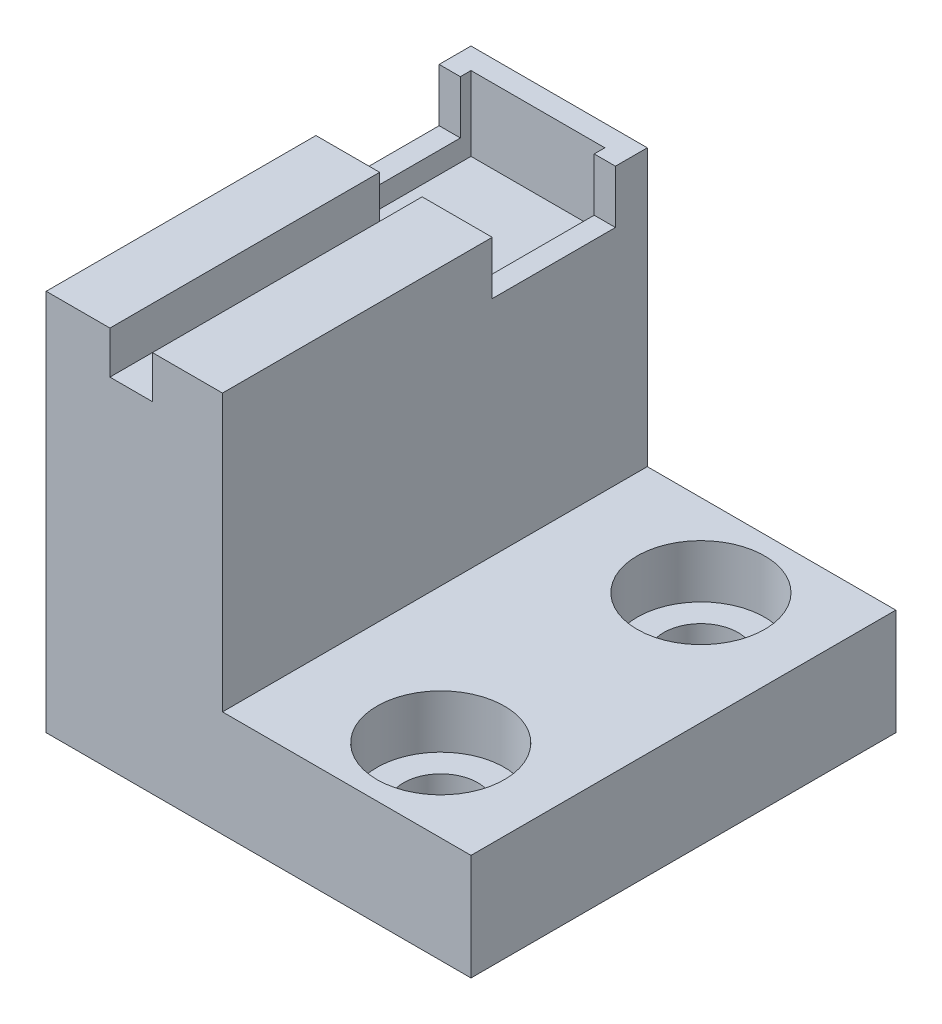
ISO-10303-21;
HEADER;
FILE_DESCRIPTION(('STEP AP214'),'2;1');
FILE_NAME('part.step','',(''),(''),'','','');
FILE_SCHEMA(('AUTOMOTIVE_DESIGN { 1 0 10303 214 1 1 1 1 }'));
ENDSEC;
DATA;
#1=APPLICATION_CONTEXT('core data for automotive mechanical design processes');
#2=APPLICATION_PROTOCOL_DEFINITION('international standard','automotive_design',2000,#1);
#3=PRODUCT_CONTEXT('',#1,'mechanical');
#4=PRODUCT('Part','Part','',(#3));
#5=PRODUCT_RELATED_PRODUCT_CATEGORY('part','',(#4));
#6=PRODUCT_DEFINITION_FORMATION('','',#4);
#7=PRODUCT_DEFINITION_CONTEXT('part definition',#1,'design');
#8=PRODUCT_DEFINITION('design','',#6,#7);
#9=PRODUCT_DEFINITION_SHAPE('','',#8);
#10=(LENGTH_UNIT() NAMED_UNIT(*) SI_UNIT(.MILLI.,.METRE.));
#11=(NAMED_UNIT(*) PLANE_ANGLE_UNIT() SI_UNIT($,.RADIAN.));
#12=(NAMED_UNIT(*) SI_UNIT($,.STERADIAN.) SOLID_ANGLE_UNIT());
#13=UNCERTAINTY_MEASURE_WITH_UNIT(LENGTH_MEASURE(1.E-05),#10,'distance_accuracy_value','');
#14=(GEOMETRIC_REPRESENTATION_CONTEXT(3) GLOBAL_UNCERTAINTY_ASSIGNED_CONTEXT((#13)) GLOBAL_UNIT_ASSIGNED_CONTEXT((#10,
#11,#12)) REPRESENTATION_CONTEXT('',''));
#15=CARTESIAN_POINT('',(0.,0.,0.));
#16=DIRECTION('',(0.,0.,1.));
#17=DIRECTION('',(1.,0.,0.));
#18=AXIS2_PLACEMENT_3D('',#15,#16,#17);
#19=CARTESIAN_POINT('',(20.,36.,-20.));
#20=DIRECTION('',(-1.,0.,0.));
#21=DIRECTION('',(0.,0.,1.));
#22=AXIS2_PLACEMENT_3D('',#19,#20,#21);
#23=PLANE('',#22);
#24=DIRECTION('',(0.,0.,-1.));
#25=VECTOR('',#24,1.);
#26=CARTESIAN_POINT('',(20.,10.,-20.));
#27=LINE('',#26,#25);
#28=CARTESIAN_POINT('',(20.,10.,20.));
#29=VERTEX_POINT('',#28);
#30=CARTESIAN_POINT('',(20.,10.,-20.));
#31=VERTEX_POINT('',#30);
#32=EDGE_CURVE('E200',#29,#31,#27,.T.);
#33=ORIENTED_EDGE('',*,*,#32,.F.);
#34=DIRECTION('',(0.,-1.,0.));
#35=VECTOR('',#34,1.);
#36=CARTESIAN_POINT('',(20.,36.,20.));
#37=LINE('',#36,#35);
#38=CARTESIAN_POINT('',(20.,0.,20.));
#39=VERTEX_POINT('',#38);
#40=EDGE_CURVE('E199',#29,#39,#37,.T.);
#41=ORIENTED_EDGE('',*,*,#40,.T.);
#42=DIRECTION('',(0.,0.,-1.));
#43=VECTOR('',#42,1.);
#44=CARTESIAN_POINT('',(20.,0.,-20.));
#45=LINE('',#44,#43);
#46=CARTESIAN_POINT('',(20.,0.,-20.));
#47=VERTEX_POINT('',#46);
#48=EDGE_CURVE('E296',#39,#47,#45,.T.);
#49=ORIENTED_EDGE('',*,*,#48,.T.);
#50=DIRECTION('',(0.,-1.,0.));
#51=VECTOR('',#50,1.);
#52=CARTESIAN_POINT('',(20.,36.,-20.));
#53=LINE('',#52,#51);
#54=EDGE_CURVE('E11',#31,#47,#53,.T.);
#55=ORIENTED_EDGE('',*,*,#54,.F.);
#56=EDGE_LOOP('',(#33,#41,#49,#55));
#57=FACE_BOUND('',#56,.T.);
#58=ADVANCED_FACE('F35',(#57),#23,.F.);
#59=CARTESIAN_POINT('',(0.,36.,0.));
#60=DIRECTION('',(0.,1.,0.));
#61=DIRECTION('',(0.,0.,1.));
#62=AXIS2_PLACEMENT_3D('',#59,#60,#61);
#63=PLANE('',#62);
#64=DIRECTION('',(0.,0.,1.));
#65=VECTOR('',#64,1.);
#66=CARTESIAN_POINT('',(-3.4,36.,-20.));
#67=LINE('',#66,#65);
#68=CARTESIAN_POINT('',(-3.4,36.,-20.));
#69=VERTEX_POINT('',#68);
#70=CARTESIAN_POINT('',(-3.4,36.,-17.));
#71=VERTEX_POINT('',#70);
#72=EDGE_CURVE('E194',#69,#71,#67,.T.);
#73=ORIENTED_EDGE('',*,*,#72,.F.);
#74=DIRECTION('',(-1.,0.,0.));
#75=VECTOR('',#74,1.);
#76=CARTESIAN_POINT('',(-20.,36.,-20.));
#77=LINE('',#76,#75);
#78=CARTESIAN_POINT('',(-20.,36.,-20.));
#79=VERTEX_POINT('',#78);
#80=EDGE_CURVE('E304',#69,#79,#77,.T.);
#81=ORIENTED_EDGE('',*,*,#80,.T.);
#82=DIRECTION('',(0.,0.,1.));
#83=VECTOR('',#82,1.);
#84=CARTESIAN_POINT('',(-20.,36.,-20.));
#85=LINE('',#84,#83);
#86=CARTESIAN_POINT('',(-20.,36.,-17.));
#87=VERTEX_POINT('',#86);
#88=EDGE_CURVE('E308',#79,#87,#85,.T.);
#89=ORIENTED_EDGE('',*,*,#88,.T.);
#90=DIRECTION('',(-1.,0.,0.));
#91=VECTOR('',#90,1.);
#92=CARTESIAN_POINT('',(-20.,36.,-17.));
#93=LINE('',#92,#91);
#94=CARTESIAN_POINT('',(-18.,36.,-17.));
#95=VERTEX_POINT('',#94);
#96=EDGE_CURVE('E235',#95,#87,#93,.T.);
#97=ORIENTED_EDGE('',*,*,#96,.F.);
#98=DIRECTION('',(0.,0.,1.));
#99=VECTOR('',#98,1.);
#100=CARTESIAN_POINT('',(-18.,36.,-18.));
#101=LINE('',#100,#99);
#102=CARTESIAN_POINT('',(-18.,36.,-18.));
#103=VERTEX_POINT('',#102);
#104=EDGE_CURVE('E287',#103,#95,#101,.T.);
#105=ORIENTED_EDGE('',*,*,#104,.F.);
#106=DIRECTION('',(-1.,0.,0.));
#107=VECTOR('',#106,1.);
#108=CARTESIAN_POINT('',(-18.,36.,-18.));
#109=LINE('',#108,#107);
#110=CARTESIAN_POINT('',(-5.4,36.,-18.));
#111=VERTEX_POINT('',#110);
#112=EDGE_CURVE('E284',#111,#103,#109,.T.);
#113=ORIENTED_EDGE('',*,*,#112,.F.);
#114=DIRECTION('',(0.,0.,-1.));
#115=VECTOR('',#114,1.);
#116=CARTESIAN_POINT('',(-5.4,36.,-18.));
#117=LINE('',#116,#115);
#118=CARTESIAN_POINT('',(-5.4,36.,-17.));
#119=VERTEX_POINT('',#118);
#120=EDGE_CURVE('E248',#119,#111,#117,.T.);
#121=ORIENTED_EDGE('',*,*,#120,.F.);
#122=DIRECTION('',(-1.,0.,0.));
#123=VECTOR('',#122,1.);
#124=CARTESIAN_POINT('',(-5.4,36.,-17.));
#125=LINE('',#124,#123);
#126=EDGE_CURVE('E223',#71,#119,#125,.T.);
#127=ORIENTED_EDGE('',*,*,#126,.F.);
#128=EDGE_LOOP('',(#73,#81,#89,#97,#105,#113,#121,#127));
#129=FACE_BOUND('',#128,.T.);
#130=ADVANCED_FACE('F369',(#129),#63,.T.);
#131=DIRECTION('',(0.,0.,1.));
#132=VECTOR('',#131,1.);
#133=CARTESIAN_POINT('',(-14.,36.,-5.4));
#134=LINE('',#133,#132);
#135=CARTESIAN_POINT('',(-14.,36.,-5.4));
#136=VERTEX_POINT('',#135);
#137=CARTESIAN_POINT('',(-14.,36.,20.));
#138=VERTEX_POINT('',#137);
#139=EDGE_CURVE('E207',#136,#138,#134,.T.);
#140=ORIENTED_EDGE('',*,*,#139,.F.);
#141=DIRECTION('',(1.,0.,0.));
#142=VECTOR('',#141,1.);
#143=CARTESIAN_POINT('',(-18.,36.,-5.4));
#144=LINE('',#143,#142);
#145=CARTESIAN_POINT('',(-20.,36.,-5.4));
#146=VERTEX_POINT('',#145);
#147=EDGE_CURVE('E273',#146,#136,#144,.T.);
#148=ORIENTED_EDGE('',*,*,#147,.F.);
#149=CARTESIAN_POINT('',(-20.,36.,20.));
#150=VERTEX_POINT('',#149);
#151=EDGE_CURVE('E306',#146,#150,#85,.T.);
#152=ORIENTED_EDGE('',*,*,#151,.T.);
#153=DIRECTION('',(1.,0.,0.));
#154=VECTOR('',#153,1.);
#155=CARTESIAN_POINT('',(-20.,36.,20.));
#156=LINE('',#155,#154);
#157=EDGE_CURVE('E312',#150,#138,#156,.T.);
#158=ORIENTED_EDGE('',*,*,#157,.T.);
#159=EDGE_LOOP('',(#140,#148,#152,#158));
#160=FACE_BOUND('',#159,.T.);
#161=ADVANCED_FACE('F374',(#160),#63,.T.);
#162=CARTESIAN_POINT('',(-20.,36.,-20.));
#163=DIRECTION('',(0.,0.,1.));
#164=DIRECTION('',(1.,0.,0.));
#165=AXIS2_PLACEMENT_3D('',#162,#163,#164);
#166=PLANE('',#165);
#167=ORIENTED_EDGE('',*,*,#80,.F.);
#168=DIRECTION('',(0.,1.,0.));
#169=VECTOR('',#168,1.);
#170=CARTESIAN_POINT('',(-3.4,10.,-20.));
#171=LINE('',#170,#169);
#172=CARTESIAN_POINT('',(-3.4,10.,-20.));
#173=VERTEX_POINT('',#172);
#174=EDGE_CURVE('E185',#173,#69,#171,.T.);
#175=ORIENTED_EDGE('',*,*,#174,.F.);
#176=DIRECTION('',(-1.,0.,0.));
#177=VECTOR('',#176,1.);
#178=CARTESIAN_POINT('',(-3.4,10.,-20.));
#179=LINE('',#178,#177);
#180=EDGE_CURVE('E186',#31,#173,#179,.T.);
#181=ORIENTED_EDGE('',*,*,#180,.F.);
#182=ORIENTED_EDGE('',*,*,#54,.T.);
#183=DIRECTION('',(-1.,0.,0.));
#184=VECTOR('',#183,1.);
#185=CARTESIAN_POINT('',(-20.,0.,-20.));
#186=LINE('',#185,#184);
#187=CARTESIAN_POINT('',(-20.,0.,-20.));
#188=VERTEX_POINT('',#187);
#189=EDGE_CURVE('E317',#47,#188,#186,.T.);
#190=ORIENTED_EDGE('',*,*,#189,.T.);
#191=DIRECTION('',(0.,-1.,0.));
#192=VECTOR('',#191,1.);
#193=CARTESIAN_POINT('',(-20.,36.,-20.));
#194=LINE('',#193,#192);
#195=EDGE_CURVE('E43',#79,#188,#194,.T.);
#196=ORIENTED_EDGE('',*,*,#195,.F.);
#197=EDGE_LOOP('',(#167,#175,#181,#182,#190,#196));
#198=FACE_BOUND('',#197,.T.);
#199=ADVANCED_FACE('F381',(#198),#166,.F.);
#200=CARTESIAN_POINT('',(-20.,36.,-20.));
#201=DIRECTION('',(1.,0.,0.));
#202=DIRECTION('',(0.,0.,-1.));
#203=AXIS2_PLACEMENT_3D('',#200,#201,#202);
#204=PLANE('',#203);
#205=DIRECTION('',(0.,0.,1.));
#206=VECTOR('',#205,1.);
#207=CARTESIAN_POINT('',(-20.,31.,-17.));
#208=LINE('',#207,#206);
#209=CARTESIAN_POINT('',(-20.,31.,-17.));
#210=VERTEX_POINT('',#209);
#211=CARTESIAN_POINT('',(-20.,31.,-5.4));
#212=VERTEX_POINT('',#211);
#213=EDGE_CURVE('E231',#210,#212,#208,.T.);
#214=ORIENTED_EDGE('',*,*,#213,.F.);
#215=DIRECTION('',(0.,1.,0.));
#216=VECTOR('',#215,1.);
#217=CARTESIAN_POINT('',(-20.,31.,-17.));
#218=LINE('',#217,#216);
#219=EDGE_CURVE('E245',#210,#87,#218,.T.);
#220=ORIENTED_EDGE('',*,*,#219,.T.);
#221=ORIENTED_EDGE('',*,*,#88,.F.);
#222=ORIENTED_EDGE('',*,*,#195,.T.);
#223=DIRECTION('',(0.,0.,1.));
#224=VECTOR('',#223,1.);
#225=CARTESIAN_POINT('',(-20.,0.,-20.));
#226=LINE('',#225,#224);
#227=CARTESIAN_POINT('',(-20.,0.,20.));
#228=VERTEX_POINT('',#227);
#229=EDGE_CURVE('E319',#188,#228,#226,.T.);
#230=ORIENTED_EDGE('',*,*,#229,.T.);
#231=DIRECTION('',(0.,-1.,0.));
#232=VECTOR('',#231,1.);
#233=CARTESIAN_POINT('',(-20.,36.,20.));
#234=LINE('',#233,#232);
#235=EDGE_CURVE('E323',#150,#228,#234,.T.);
#236=ORIENTED_EDGE('',*,*,#235,.F.);
#237=ORIENTED_EDGE('',*,*,#151,.F.);
#238=DIRECTION('',(0.,1.,0.));
#239=VECTOR('',#238,1.);
#240=CARTESIAN_POINT('',(-20.,31.,-5.4));
#241=LINE('',#240,#239);
#242=EDGE_CURVE('E242',#212,#146,#241,.T.);
#243=ORIENTED_EDGE('',*,*,#242,.F.);
#244=EDGE_LOOP('',(#214,#220,#221,#222,#230,#236,#237,#243));
#245=FACE_BOUND('',#244,.T.);
#246=ADVANCED_FACE('F419',(#245),#204,.F.);
#247=CARTESIAN_POINT('',(-20.,36.,20.));
#248=DIRECTION('',(0.,0.,-1.));
#249=DIRECTION('',(-1.,0.,0.));
#250=AXIS2_PLACEMENT_3D('',#247,#248,#249);
#251=PLANE('',#250);
#252=DIRECTION('',(1.,0.,0.));
#253=VECTOR('',#252,1.);
#254=CARTESIAN_POINT('',(-3.4,10.,20.));
#255=LINE('',#254,#253);
#256=CARTESIAN_POINT('',(-3.4,10.,20.));
#257=VERTEX_POINT('',#256);
#258=EDGE_CURVE('E190',#257,#29,#255,.T.);
#259=ORIENTED_EDGE('',*,*,#258,.F.);
#260=DIRECTION('',(0.,1.,0.));
#261=VECTOR('',#260,1.);
#262=CARTESIAN_POINT('',(-3.4,10.,20.));
#263=LINE('',#262,#261);
#264=CARTESIAN_POINT('',(-3.4,36.,20.));
#265=VERTEX_POINT('',#264);
#266=EDGE_CURVE('E174',#257,#265,#263,.T.);
#267=ORIENTED_EDGE('',*,*,#266,.T.);
#268=CARTESIAN_POINT('',(-10.,36.,20.));
#269=VERTEX_POINT('',#268);
#270=EDGE_CURVE('E311',#269,#265,#156,.T.);
#271=ORIENTED_EDGE('',*,*,#270,.F.);
#272=DIRECTION('',(0.,1.,0.));
#273=VECTOR('',#272,1.);
#274=CARTESIAN_POINT('',(-10.,32.,20.));
#275=LINE('',#274,#273);
#276=CARTESIAN_POINT('',(-10.,32.,20.));
#277=VERTEX_POINT('',#276);
#278=EDGE_CURVE('E227',#277,#269,#275,.T.);
#279=ORIENTED_EDGE('',*,*,#278,.F.);
#280=DIRECTION('',(1.,0.,0.));
#281=VECTOR('',#280,1.);
#282=CARTESIAN_POINT('',(-14.,32.,20.));
#283=LINE('',#282,#281);
#284=CARTESIAN_POINT('',(-14.,32.,20.));
#285=VERTEX_POINT('',#284);
#286=EDGE_CURVE('E212',#285,#277,#283,.T.);
#287=ORIENTED_EDGE('',*,*,#286,.F.);
#288=DIRECTION('',(0.,1.,0.));
#289=VECTOR('',#288,1.);
#290=CARTESIAN_POINT('',(-14.,32.,20.));
#291=LINE('',#290,#289);
#292=EDGE_CURVE('E218',#285,#138,#291,.T.);
#293=ORIENTED_EDGE('',*,*,#292,.T.);
#294=ORIENTED_EDGE('',*,*,#157,.F.);
#295=ORIENTED_EDGE('',*,*,#235,.T.);
#296=DIRECTION('',(1.,0.,0.));
#297=VECTOR('',#296,1.);
#298=CARTESIAN_POINT('',(-20.,0.,20.));
#299=LINE('',#298,#297);
#300=EDGE_CURVE('E307',#228,#39,#299,.T.);
#301=ORIENTED_EDGE('',*,*,#300,.T.);
#302=ORIENTED_EDGE('',*,*,#40,.F.);
#303=EDGE_LOOP('',(#259,#267,#271,#279,#287,#293,#294,#295,#301,#302));
#304=FACE_BOUND('',#303,.T.);
#305=ADVANCED_FACE('F197',(#304),#251,.F.);
#306=CARTESIAN_POINT('',(-3.4,36.,-5.4));
#307=VERTEX_POINT('',#306);
#308=EDGE_CURVE('E180',#307,#265,#67,.T.);
#309=ORIENTED_EDGE('',*,*,#308,.F.);
#310=CARTESIAN_POINT('',(-10.,36.,-5.4));
#311=VERTEX_POINT('',#310);
#312=EDGE_CURVE('E290',#311,#307,#144,.T.);
#313=ORIENTED_EDGE('',*,*,#312,.F.);
#314=DIRECTION('',(0.,0.,-1.));
#315=VECTOR('',#314,1.);
#316=CARTESIAN_POINT('',(-10.,36.,-5.4));
#317=LINE('',#316,#315);
#318=EDGE_CURVE('E213',#269,#311,#317,.T.);
#319=ORIENTED_EDGE('',*,*,#318,.F.);
#320=ORIENTED_EDGE('',*,*,#270,.T.);
#321=EDGE_LOOP('',(#309,#313,#319,#320));
#322=FACE_BOUND('',#321,.T.);
#323=ADVANCED_FACE('F377',(#322),#63,.T.);
#324=CARTESIAN_POINT('',(0.,0.,0.));
#325=DIRECTION('',(0.,1.,0.));
#326=DIRECTION('',(0.,0.,1.));
#327=AXIS2_PLACEMENT_3D('',#324,#325,#326);
#328=PLANE('',#327);
#329=CARTESIAN_POINT('',(9.4,0.,-12.25));
#330=DIRECTION('',(0.,1.,0.));
#331=DIRECTION('',(0.,0.,1.));
#332=AXIS2_PLACEMENT_3D('',#329,#330,#331);
#333=CIRCLE('',#332,3.5);
#334=CARTESIAN_POINT('',(9.4,0.,-8.75));
#335=VERTEX_POINT('',#334);
#336=EDGE_CURVE('E329',#335,#335,#333,.T.);
#337=ORIENTED_EDGE('',*,*,#336,.T.);
#338=EDGE_LOOP('',(#337));
#339=FACE_BOUND('',#338,.T.);
#340=CARTESIAN_POINT('',(9.4,0.,12.25));
#341=DIRECTION('',(0.,1.,0.));
#342=DIRECTION('',(0.,0.,1.));
#343=AXIS2_PLACEMENT_3D('',#340,#341,#342);
#344=CIRCLE('',#343,3.5);
#345=CARTESIAN_POINT('',(9.4,0.,15.75));
#346=VERTEX_POINT('',#345);
#347=EDGE_CURVE('E335',#346,#346,#344,.T.);
#348=ORIENTED_EDGE('',*,*,#347,.T.);
#349=EDGE_LOOP('',(#348));
#350=FACE_BOUND('',#349,.T.);
#351=ORIENTED_EDGE('',*,*,#48,.F.);
#352=ORIENTED_EDGE('',*,*,#300,.F.);
#353=ORIENTED_EDGE('',*,*,#229,.F.);
#354=ORIENTED_EDGE('',*,*,#189,.F.);
#355=EDGE_LOOP('',(#351,#352,#353,#354));
#356=FACE_BOUND('',#355,.T.);
#357=ADVANCED_FACE('F424',(#339,#350,#356),#328,.F.);
#358=CARTESIAN_POINT('',(-5.4,29.,-18.));
#359=DIRECTION('',(1.,0.,0.));
#360=DIRECTION('',(0.,0.,-1.));
#361=AXIS2_PLACEMENT_3D('',#358,#359,#360);
#362=PLANE('',#361);
#363=DIRECTION('',(0.,0.,1.));
#364=VECTOR('',#363,1.);
#365=CARTESIAN_POINT('',(-5.4,31.,-5.4));
#366=LINE('',#365,#364);
#367=CARTESIAN_POINT('',(-5.4,31.,-17.));
#368=VERTEX_POINT('',#367);
#369=CARTESIAN_POINT('',(-5.4,31.,-5.4));
#370=VERTEX_POINT('',#369);
#371=EDGE_CURVE('E59',#368,#370,#366,.T.);
#372=ORIENTED_EDGE('',*,*,#371,.F.);
#373=DIRECTION('',(0.,1.,0.));
#374=VECTOR('',#373,1.);
#375=CARTESIAN_POINT('',(-5.4,31.,-17.));
#376=LINE('',#375,#374);
#377=EDGE_CURVE('E244',#368,#119,#376,.T.);
#378=ORIENTED_EDGE('',*,*,#377,.T.);
#379=ORIENTED_EDGE('',*,*,#120,.T.);
#380=DIRECTION('',(0.,1.,0.));
#381=VECTOR('',#380,1.);
#382=CARTESIAN_POINT('',(-5.4,29.,-18.));
#383=LINE('',#382,#381);
#384=CARTESIAN_POINT('',(-5.4,29.,-18.));
#385=VERTEX_POINT('',#384);
#386=EDGE_CURVE('E282',#385,#111,#383,.T.);
#387=ORIENTED_EDGE('',*,*,#386,.F.);
#388=DIRECTION('',(0.,0.,-1.));
#389=VECTOR('',#388,1.);
#390=CARTESIAN_POINT('',(-5.4,29.,-18.));
#391=LINE('',#390,#389);
#392=CARTESIAN_POINT('',(-5.4,29.,-5.4));
#393=VERTEX_POINT('',#392);
#394=EDGE_CURVE('E269',#393,#385,#391,.T.);
#395=ORIENTED_EDGE('',*,*,#394,.F.);
#396=DIRECTION('',(0.,1.,0.));
#397=VECTOR('',#396,1.);
#398=CARTESIAN_POINT('',(-5.4,29.,-5.4));
#399=LINE('',#398,#397);
#400=EDGE_CURVE('E293',#393,#370,#399,.T.);
#401=ORIENTED_EDGE('',*,*,#400,.T.);
#402=EDGE_LOOP('',(#372,#378,#379,#387,#395,#401));
#403=FACE_BOUND('',#402,.T.);
#404=ADVANCED_FACE('F392',(#403),#362,.F.);
#405=CARTESIAN_POINT('',(-18.,29.,-5.4));
#406=DIRECTION('',(0.,0.,1.));
#407=DIRECTION('',(1.,0.,0.));
#408=AXIS2_PLACEMENT_3D('',#405,#406,#407);
#409=PLANE('',#408);
#410=ORIENTED_EDGE('',*,*,#147,.T.);
#411=DIRECTION('',(0.,1.,0.));
#412=VECTOR('',#411,1.);
#413=CARTESIAN_POINT('',(-14.,32.,-5.4));
#414=LINE('',#413,#412);
#415=CARTESIAN_POINT('',(-14.,32.,-5.4));
#416=VERTEX_POINT('',#415);
#417=EDGE_CURVE('E221',#416,#136,#414,.T.);
#418=ORIENTED_EDGE('',*,*,#417,.F.);
#419=DIRECTION('',(-1.,0.,0.));
#420=VECTOR('',#419,1.);
#421=CARTESIAN_POINT('',(-14.,32.,-5.4));
#422=LINE('',#421,#420);
#423=CARTESIAN_POINT('',(-10.,32.,-5.4));
#424=VERTEX_POINT('',#423);
#425=EDGE_CURVE('E216',#424,#416,#422,.T.);
#426=ORIENTED_EDGE('',*,*,#425,.F.);
#427=DIRECTION('',(0.,1.,0.));
#428=VECTOR('',#427,1.);
#429=CARTESIAN_POINT('',(-10.,32.,-5.4));
#430=LINE('',#429,#428);
#431=EDGE_CURVE('E224',#424,#311,#430,.T.);
#432=ORIENTED_EDGE('',*,*,#431,.T.);
#433=ORIENTED_EDGE('',*,*,#312,.T.);
#434=DIRECTION('',(0.,1.,0.));
#435=VECTOR('',#434,1.);
#436=CARTESIAN_POINT('',(-3.4,31.,-5.4));
#437=LINE('',#436,#435);
#438=CARTESIAN_POINT('',(-3.4,31.,-5.4));
#439=VERTEX_POINT('',#438);
#440=EDGE_CURVE('E261',#439,#307,#437,.T.);
#441=ORIENTED_EDGE('',*,*,#440,.F.);
#442=DIRECTION('',(1.,0.,0.));
#443=VECTOR('',#442,1.);
#444=CARTESIAN_POINT('',(-5.4,31.,-5.4));
#445=LINE('',#444,#443);
#446=EDGE_CURVE('E254',#370,#439,#445,.T.);
#447=ORIENTED_EDGE('',*,*,#446,.F.);
#448=ORIENTED_EDGE('',*,*,#400,.F.);
#449=DIRECTION('',(1.,0.,0.));
#450=VECTOR('',#449,1.);
#451=CARTESIAN_POINT('',(-18.,29.,-5.4));
#452=LINE('',#451,#450);
#453=CARTESIAN_POINT('',(-18.,29.,-5.4));
#454=VERTEX_POINT('',#453);
#455=EDGE_CURVE('E279',#454,#393,#452,.T.);
#456=ORIENTED_EDGE('',*,*,#455,.F.);
#457=DIRECTION('',(0.,1.,0.));
#458=VECTOR('',#457,1.);
#459=CARTESIAN_POINT('',(-18.,29.,-5.4));
#460=LINE('',#459,#458);
#461=CARTESIAN_POINT('',(-18.,31.,-5.4));
#462=VERTEX_POINT('',#461);
#463=EDGE_CURVE('E297',#454,#462,#460,.T.);
#464=ORIENTED_EDGE('',*,*,#463,.T.);
#465=DIRECTION('',(1.,0.,0.));
#466=VECTOR('',#465,1.);
#467=CARTESIAN_POINT('',(-20.,31.,-5.4));
#468=LINE('',#467,#466);
#469=EDGE_CURVE('E234',#212,#462,#468,.T.);
#470=ORIENTED_EDGE('',*,*,#469,.F.);
#471=ORIENTED_EDGE('',*,*,#242,.T.);
#472=EDGE_LOOP('',(#410,#418,#426,#432,#433,#441,#447,#448,#456,#464,#470,#471));
#473=FACE_BOUND('',#472,.T.);
#474=ADVANCED_FACE('F396',(#473),#409,.F.);
#475=CARTESIAN_POINT('',(-18.,29.,-18.));
#476=DIRECTION('',(-1.,0.,0.));
#477=DIRECTION('',(0.,0.,1.));
#478=AXIS2_PLACEMENT_3D('',#475,#476,#477);
#479=PLANE('',#478);
#480=ORIENTED_EDGE('',*,*,#104,.T.);
#481=DIRECTION('',(0.,1.,0.));
#482=VECTOR('',#481,1.);
#483=CARTESIAN_POINT('',(-18.,31.,-17.));
#484=LINE('',#483,#482);
#485=CARTESIAN_POINT('',(-18.,31.,-17.));
#486=VERTEX_POINT('',#485);
#487=EDGE_CURVE('E249',#486,#95,#484,.T.);
#488=ORIENTED_EDGE('',*,*,#487,.F.);
#489=DIRECTION('',(0.,0.,-1.));
#490=VECTOR('',#489,1.);
#491=CARTESIAN_POINT('',(-18.,31.,-17.));
#492=LINE('',#491,#490);
#493=EDGE_CURVE('E237',#462,#486,#492,.T.);
#494=ORIENTED_EDGE('',*,*,#493,.F.);
#495=ORIENTED_EDGE('',*,*,#463,.F.);
#496=DIRECTION('',(0.,0.,1.));
#497=VECTOR('',#496,1.);
#498=CARTESIAN_POINT('',(-18.,29.,-18.));
#499=LINE('',#498,#497);
#500=CARTESIAN_POINT('',(-18.,29.,-18.));
#501=VERTEX_POINT('',#500);
#502=EDGE_CURVE('E276',#501,#454,#499,.T.);
#503=ORIENTED_EDGE('',*,*,#502,.F.);
#504=DIRECTION('',(0.,1.,0.));
#505=VECTOR('',#504,1.);
#506=CARTESIAN_POINT('',(-18.,29.,-18.));
#507=LINE('',#506,#505);
#508=EDGE_CURVE('E300',#501,#103,#507,.T.);
#509=ORIENTED_EDGE('',*,*,#508,.T.);
#510=EDGE_LOOP('',(#480,#488,#494,#495,#503,#509));
#511=FACE_BOUND('',#510,.T.);
#512=ADVANCED_FACE('F431',(#511),#479,.F.);
#513=CARTESIAN_POINT('',(-18.,29.,-18.));
#514=DIRECTION('',(0.,0.,-1.));
#515=DIRECTION('',(-1.,0.,0.));
#516=AXIS2_PLACEMENT_3D('',#513,#514,#515);
#517=PLANE('',#516);
#518=ORIENTED_EDGE('',*,*,#112,.T.);
#519=ORIENTED_EDGE('',*,*,#508,.F.);
#520=DIRECTION('',(-1.,0.,0.));
#521=VECTOR('',#520,1.);
#522=CARTESIAN_POINT('',(-18.,29.,-18.));
#523=LINE('',#522,#521);
#524=EDGE_CURVE('E272',#385,#501,#523,.T.);
#525=ORIENTED_EDGE('',*,*,#524,.F.);
#526=ORIENTED_EDGE('',*,*,#386,.T.);
#527=EDGE_LOOP('',(#518,#519,#525,#526));
#528=FACE_BOUND('',#527,.T.);
#529=ADVANCED_FACE('F436',(#528),#517,.F.);
#530=CARTESIAN_POINT('',(0.,29.,0.));
#531=DIRECTION('',(0.,1.,0.));
#532=DIRECTION('',(0.,0.,1.));
#533=AXIS2_PLACEMENT_3D('',#530,#531,#532);
#534=PLANE('',#533);
#535=ORIENTED_EDGE('',*,*,#394,.T.);
#536=ORIENTED_EDGE('',*,*,#524,.T.);
#537=ORIENTED_EDGE('',*,*,#502,.T.);
#538=ORIENTED_EDGE('',*,*,#455,.T.);
#539=EDGE_LOOP('',(#535,#536,#537,#538));
#540=FACE_BOUND('',#539,.T.);
#541=ADVANCED_FACE('F438',(#540),#534,.T.);
#542=CARTESIAN_POINT('',(-20.,31.,-17.));
#543=DIRECTION('',(0.,0.,-1.));
#544=DIRECTION('',(-1.,0.,0.));
#545=AXIS2_PLACEMENT_3D('',#542,#543,#544);
#546=PLANE('',#545);
#547=ORIENTED_EDGE('',*,*,#96,.T.);
#548=ORIENTED_EDGE('',*,*,#219,.F.);
#549=DIRECTION('',(-1.,0.,0.));
#550=VECTOR('',#549,1.);
#551=CARTESIAN_POINT('',(-20.,31.,-17.));
#552=LINE('',#551,#550);
#553=EDGE_CURVE('E239',#486,#210,#552,.T.);
#554=ORIENTED_EDGE('',*,*,#553,.F.);
#555=ORIENTED_EDGE('',*,*,#487,.T.);
#556=EDGE_LOOP('',(#547,#548,#554,#555));
#557=FACE_BOUND('',#556,.T.);
#558=ADVANCED_FACE('F440',(#557),#546,.F.);
#559=CARTESIAN_POINT('',(0.,31.,0.));
#560=DIRECTION('',(0.,1.,0.));
#561=DIRECTION('',(0.,0.,1.));
#562=AXIS2_PLACEMENT_3D('',#559,#560,#561);
#563=PLANE('',#562);
#564=ORIENTED_EDGE('',*,*,#213,.T.);
#565=ORIENTED_EDGE('',*,*,#469,.T.);
#566=ORIENTED_EDGE('',*,*,#493,.T.);
#567=ORIENTED_EDGE('',*,*,#553,.T.);
#568=EDGE_LOOP('',(#564,#565,#566,#567));
#569=FACE_BOUND('',#568,.T.);
#570=ADVANCED_FACE('F446',(#569),#563,.T.);
#571=CARTESIAN_POINT('',(-5.4,31.,-17.));
#572=DIRECTION('',(0.,0.,-1.));
#573=DIRECTION('',(-1.,0.,0.));
#574=AXIS2_PLACEMENT_3D('',#571,#572,#573);
#575=PLANE('',#574);
#576=ORIENTED_EDGE('',*,*,#126,.T.);
#577=ORIENTED_EDGE('',*,*,#377,.F.);
#578=DIRECTION('',(-1.,0.,0.));
#579=VECTOR('',#578,1.);
#580=CARTESIAN_POINT('',(-5.4,31.,-17.));
#581=LINE('',#580,#579);
#582=CARTESIAN_POINT('',(-3.4,31.,-17.));
#583=VERTEX_POINT('',#582);
#584=EDGE_CURVE('E259',#583,#368,#581,.T.);
#585=ORIENTED_EDGE('',*,*,#584,.F.);
#586=DIRECTION('',(0.,1.,0.));
#587=VECTOR('',#586,1.);
#588=CARTESIAN_POINT('',(-3.4,31.,-17.));
#589=LINE('',#588,#587);
#590=EDGE_CURVE('E265',#583,#71,#589,.T.);
#591=ORIENTED_EDGE('',*,*,#590,.T.);
#592=EDGE_LOOP('',(#576,#577,#585,#591));
#593=FACE_BOUND('',#592,.T.);
#594=ADVANCED_FACE('F389',(#593),#575,.F.);
#595=CARTESIAN_POINT('',(0.,31.,0.));
#596=DIRECTION('',(0.,-1.,0.));
#597=DIRECTION('',(0.,0.,-1.));
#598=AXIS2_PLACEMENT_3D('',#595,#596,#597);
#599=PLANE('',#598);
#600=ORIENTED_EDGE('',*,*,#371,.T.);
#601=ORIENTED_EDGE('',*,*,#446,.T.);
#602=DIRECTION('',(0.,0.,-1.));
#603=VECTOR('',#602,1.);
#604=CARTESIAN_POINT('',(-3.4,31.,-5.4));
#605=LINE('',#604,#603);
#606=EDGE_CURVE('E256',#439,#583,#605,.T.);
#607=ORIENTED_EDGE('',*,*,#606,.T.);
#608=ORIENTED_EDGE('',*,*,#584,.T.);
#609=EDGE_LOOP('',(#600,#601,#607,#608));
#610=FACE_BOUND('',#609,.T.);
#611=ADVANCED_FACE('F399',(#610),#599,.F.);
#612=CARTESIAN_POINT('',(-14.,32.,-5.4));
#613=DIRECTION('',(-1.,0.,0.));
#614=DIRECTION('',(0.,0.,1.));
#615=AXIS2_PLACEMENT_3D('',#612,#613,#614);
#616=PLANE('',#615);
#617=ORIENTED_EDGE('',*,*,#139,.T.);
#618=ORIENTED_EDGE('',*,*,#292,.F.);
#619=DIRECTION('',(0.,0.,1.));
#620=VECTOR('',#619,1.);
#621=CARTESIAN_POINT('',(-14.,32.,-5.4));
#622=LINE('',#621,#620);
#623=EDGE_CURVE('E209',#416,#285,#622,.T.);
#624=ORIENTED_EDGE('',*,*,#623,.F.);
#625=ORIENTED_EDGE('',*,*,#417,.T.);
#626=EDGE_LOOP('',(#617,#618,#624,#625));
#627=FACE_BOUND('',#626,.T.);
#628=ADVANCED_FACE('F411',(#627),#616,.F.);
#629=CARTESIAN_POINT('',(-10.,32.,-5.4));
#630=DIRECTION('',(1.,0.,0.));
#631=DIRECTION('',(0.,0.,-1.));
#632=AXIS2_PLACEMENT_3D('',#629,#630,#631);
#633=PLANE('',#632);
#634=ORIENTED_EDGE('',*,*,#318,.T.);
#635=ORIENTED_EDGE('',*,*,#431,.F.);
#636=DIRECTION('',(0.,0.,-1.));
#637=VECTOR('',#636,1.);
#638=CARTESIAN_POINT('',(-10.,32.,-5.4));
#639=LINE('',#638,#637);
#640=EDGE_CURVE('E51',#277,#424,#639,.T.);
#641=ORIENTED_EDGE('',*,*,#640,.F.);
#642=ORIENTED_EDGE('',*,*,#278,.T.);
#643=EDGE_LOOP('',(#634,#635,#641,#642));
#644=FACE_BOUND('',#643,.T.);
#645=ADVANCED_FACE('F406',(#644),#633,.F.);
#646=CARTESIAN_POINT('',(0.,32.,0.));
#647=DIRECTION('',(0.,1.,0.));
#648=DIRECTION('',(0.,0.,1.));
#649=AXIS2_PLACEMENT_3D('',#646,#647,#648);
#650=PLANE('',#649);
#651=ORIENTED_EDGE('',*,*,#623,.T.);
#652=ORIENTED_EDGE('',*,*,#286,.T.);
#653=ORIENTED_EDGE('',*,*,#640,.T.);
#654=ORIENTED_EDGE('',*,*,#425,.T.);
#655=EDGE_LOOP('',(#651,#652,#653,#654));
#656=FACE_BOUND('',#655,.T.);
#657=ADVANCED_FACE('F365',(#656),#650,.T.);
#658=CARTESIAN_POINT('',(-3.4,10.,-20.));
#659=DIRECTION('',(-1.,0.,0.));
#660=DIRECTION('',(0.,0.,1.));
#661=AXIS2_PLACEMENT_3D('',#658,#659,#660);
#662=PLANE('',#661);
#663=ORIENTED_EDGE('',*,*,#308,.T.);
#664=ORIENTED_EDGE('',*,*,#266,.F.);
#665=DIRECTION('',(0.,0.,1.));
#666=VECTOR('',#665,1.);
#667=CARTESIAN_POINT('',(-3.4,10.,-20.));
#668=LINE('',#667,#666);
#669=EDGE_CURVE('E177',#173,#257,#668,.T.);
#670=ORIENTED_EDGE('',*,*,#669,.F.);
#671=ORIENTED_EDGE('',*,*,#174,.T.);
#672=ORIENTED_EDGE('',*,*,#72,.T.);
#673=ORIENTED_EDGE('',*,*,#590,.F.);
#674=ORIENTED_EDGE('',*,*,#606,.F.);
#675=ORIENTED_EDGE('',*,*,#440,.T.);
#676=EDGE_LOOP('',(#663,#664,#670,#671,#672,#673,#674,#675));
#677=FACE_BOUND('',#676,.T.);
#678=ADVANCED_FACE('F176',(#677),#662,.F.);
#679=CARTESIAN_POINT('',(0.,10.,0.));
#680=DIRECTION('',(0.,1.,0.));
#681=DIRECTION('',(0.,0.,1.));
#682=AXIS2_PLACEMENT_3D('',#679,#680,#681);
#683=PLANE('',#682);
#684=CARTESIAN_POINT('',(9.4,10.,-12.25));
#685=DIRECTION('',(0.,1.,0.));
#686=DIRECTION('',(0.,0.,1.));
#687=AXIS2_PLACEMENT_3D('',#684,#685,#686);
#688=CIRCLE('',#687,6.);
#689=CARTESIAN_POINT('',(9.4,10.,-6.25));
#690=VERTEX_POINT('',#689);
#691=EDGE_CURVE('E345',#690,#690,#688,.T.);
#692=ORIENTED_EDGE('',*,*,#691,.F.);
#693=EDGE_LOOP('',(#692));
#694=FACE_BOUND('',#693,.T.);
#695=CARTESIAN_POINT('',(9.4,10.,12.25));
#696=DIRECTION('',(0.,1.,0.));
#697=DIRECTION('',(0.,0.,1.));
#698=AXIS2_PLACEMENT_3D('',#695,#696,#697);
#699=CIRCLE('',#698,6.);
#700=CARTESIAN_POINT('',(9.4,10.,18.25));
#701=VERTEX_POINT('',#700);
#702=EDGE_CURVE('E333',#701,#701,#699,.T.);
#703=ORIENTED_EDGE('',*,*,#702,.F.);
#704=EDGE_LOOP('',(#703));
#705=FACE_BOUND('',#704,.T.);
#706=ORIENTED_EDGE('',*,*,#669,.T.);
#707=ORIENTED_EDGE('',*,*,#258,.T.);
#708=ORIENTED_EDGE('',*,*,#32,.T.);
#709=ORIENTED_EDGE('',*,*,#180,.T.);
#710=EDGE_LOOP('',(#706,#707,#708,#709));
#711=FACE_BOUND('',#710,.T.);
#712=ADVANCED_FACE('F189',(#694,#705,#711),#683,.T.);
#713=CARTESIAN_POINT('',(9.4,5.,12.25));
#714=DIRECTION('',(0.,1.,0.));
#715=DIRECTION('',(0.,0.,1.));
#716=AXIS2_PLACEMENT_3D('',#713,#714,#715);
#717=CYLINDRICAL_SURFACE('',#716,6.);
#718=CARTESIAN_POINT('',(9.4,5.,12.25));
#719=DIRECTION('',(0.,1.,0.));
#720=DIRECTION('',(0.,0.,1.));
#721=AXIS2_PLACEMENT_3D('',#718,#719,#720);
#722=CIRCLE('',#721,6.);
#723=CARTESIAN_POINT('',(9.4,5.,18.25));
#724=VERTEX_POINT('',#723);
#725=EDGE_CURVE('E348',#724,#724,#722,.T.);
#726=ORIENTED_EDGE('',*,*,#725,.F.);
#727=EDGE_LOOP('',(#726));
#728=FACE_BOUND('',#727,.T.);
#729=ORIENTED_EDGE('',*,*,#702,.T.);
#730=EDGE_LOOP('',(#729));
#731=FACE_BOUND('',#730,.T.);
#732=ADVANCED_FACE('F353',(#728,#731),#717,.F.);
#733=CARTESIAN_POINT('',(9.4,5.,12.25));
#734=DIRECTION('',(0.,1.,0.));
#735=DIRECTION('',(0.,0.,1.));
#736=AXIS2_PLACEMENT_3D('',#733,#734,#735);
#737=PLANE('',#736);
#738=CARTESIAN_POINT('',(9.4,5.,12.25));
#739=DIRECTION('',(0.,1.,0.));
#740=DIRECTION('',(0.,0.,1.));
#741=AXIS2_PLACEMENT_3D('',#738,#739,#740);
#742=CIRCLE('',#741,3.5);
#743=CARTESIAN_POINT('',(9.4,5.,15.75));
#744=VERTEX_POINT('',#743);
#745=EDGE_CURVE('E38',#744,#744,#742,.T.);
#746=ORIENTED_EDGE('',*,*,#745,.F.);
#747=EDGE_LOOP('',(#746));
#748=FACE_BOUND('',#747,.T.);
#749=ORIENTED_EDGE('',*,*,#725,.T.);
#750=EDGE_LOOP('',(#749));
#751=FACE_BOUND('',#750,.T.);
#752=ADVANCED_FACE('F362',(#748,#751),#737,.T.);
#753=CARTESIAN_POINT('',(9.4,5.,-12.25));
#754=DIRECTION('',(0.,1.,0.));
#755=DIRECTION('',(0.,0.,1.));
#756=AXIS2_PLACEMENT_3D('',#753,#754,#755);
#757=CYLINDRICAL_SURFACE('',#756,6.);
#758=CARTESIAN_POINT('',(9.4,5.,-12.25));
#759=DIRECTION('',(0.,1.,0.));
#760=DIRECTION('',(0.,0.,1.));
#761=AXIS2_PLACEMENT_3D('',#758,#759,#760);
#762=CIRCLE('',#761,6.);
#763=CARTESIAN_POINT('',(9.4,5.,-6.25));
#764=VERTEX_POINT('',#763);
#765=EDGE_CURVE('E342',#764,#764,#762,.T.);
#766=ORIENTED_EDGE('',*,*,#765,.F.);
#767=EDGE_LOOP('',(#766));
#768=FACE_BOUND('',#767,.T.);
#769=ORIENTED_EDGE('',*,*,#691,.T.);
#770=EDGE_LOOP('',(#769));
#771=FACE_BOUND('',#770,.T.);
#772=ADVANCED_FACE('F547',(#768,#771),#757,.F.);
#773=CARTESIAN_POINT('',(9.4,5.,-12.25));
#774=DIRECTION('',(0.,1.,0.));
#775=DIRECTION('',(0.,0.,1.));
#776=AXIS2_PLACEMENT_3D('',#773,#774,#775);
#777=PLANE('',#776);
#778=CARTESIAN_POINT('',(9.4,5.,-12.25));
#779=DIRECTION('',(0.,1.,0.));
#780=DIRECTION('',(0.,0.,1.));
#781=AXIS2_PLACEMENT_3D('',#778,#779,#780);
#782=CIRCLE('',#781,3.5);
#783=CARTESIAN_POINT('',(9.4,5.,-8.75));
#784=VERTEX_POINT('',#783);
#785=EDGE_CURVE('E327',#784,#784,#782,.T.);
#786=ORIENTED_EDGE('',*,*,#785,.F.);
#787=EDGE_LOOP('',(#786));
#788=FACE_BOUND('',#787,.T.);
#789=ORIENTED_EDGE('',*,*,#765,.T.);
#790=EDGE_LOOP('',(#789));
#791=FACE_BOUND('',#790,.T.);
#792=ADVANCED_FACE('F552',(#788,#791),#777,.T.);
#793=CARTESIAN_POINT('',(9.4,0.,-12.25));
#794=DIRECTION('',(0.,1.,0.));
#795=DIRECTION('',(0.,0.,1.));
#796=AXIS2_PLACEMENT_3D('',#793,#794,#795);
#797=CYLINDRICAL_SURFACE('',#796,3.5);
#798=ORIENTED_EDGE('',*,*,#785,.T.);
#799=EDGE_LOOP('',(#798));
#800=FACE_BOUND('',#799,.T.);
#801=ORIENTED_EDGE('',*,*,#336,.F.);
#802=EDGE_LOOP('',(#801));
#803=FACE_BOUND('',#802,.T.);
#804=ADVANCED_FACE('F575',(#800,#803),#797,.F.);
#805=CARTESIAN_POINT('',(9.4,0.,12.25));
#806=DIRECTION('',(0.,1.,0.));
#807=DIRECTION('',(0.,0.,1.));
#808=AXIS2_PLACEMENT_3D('',#805,#806,#807);
#809=CYLINDRICAL_SURFACE('',#808,3.5);
#810=ORIENTED_EDGE('',*,*,#745,.T.);
#811=EDGE_LOOP('',(#810));
#812=FACE_BOUND('',#811,.T.);
#813=ORIENTED_EDGE('',*,*,#347,.F.);
#814=EDGE_LOOP('',(#813));
#815=FACE_BOUND('',#814,.T.);
#816=ADVANCED_FACE('F585',(#812,#815),#809,.F.);
#817=CLOSED_SHELL('',(#58,#130,#161,#199,#246,#305,#323,#357,#404,#474,#512,#529,#541,#558,#570,
#594,#611,#628,#645,#657,#678,#712,#732,#752,#772,#792,#804,#816));
#818=MANIFOLD_SOLID_BREP('B2',#817);
#819=ADVANCED_BREP_SHAPE_REPRESENTATION('',(#18,#818),#14);
#820=SHAPE_DEFINITION_REPRESENTATION(#9,#819);
ENDSEC;
END-ISO-10303-21;
